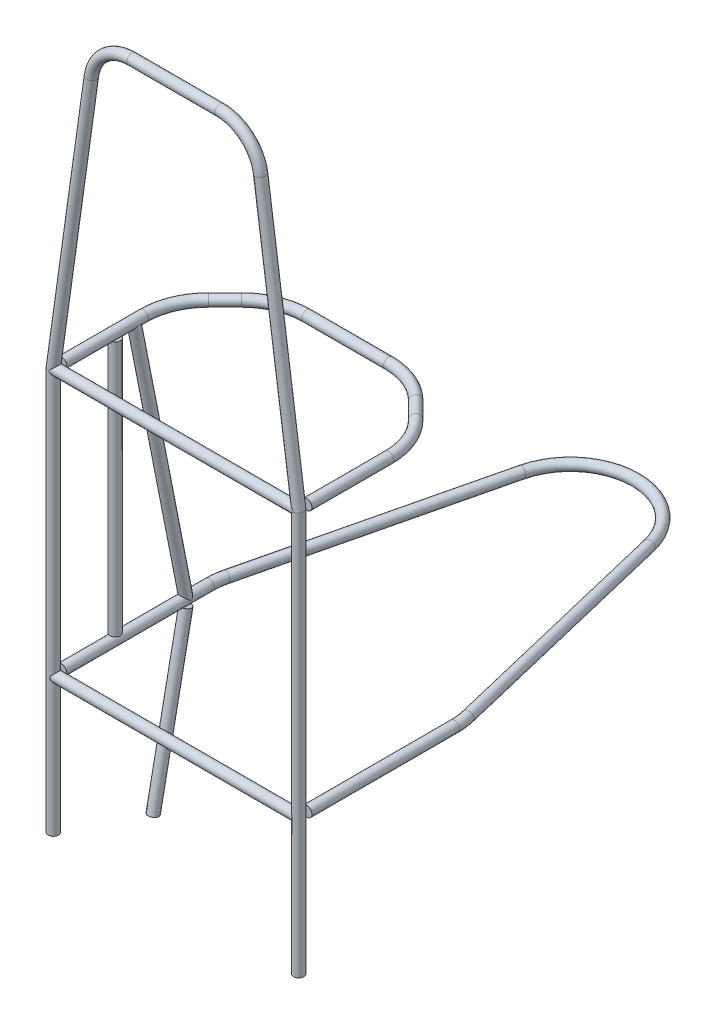
ISO-10303-21;
HEADER;
FILE_DESCRIPTION(('STEP AP214'),'2;1');
FILE_NAME('part.step','',(''),(''),'','','');
FILE_SCHEMA(('AUTOMOTIVE_DESIGN { 1 0 10303 214 1 1 1 1 }'));
ENDSEC;
DATA;
#1=APPLICATION_CONTEXT('core data for automotive mechanical design processes');
#2=APPLICATION_PROTOCOL_DEFINITION('international standard','automotive_design',2000,#1);
#3=PRODUCT_CONTEXT('',#1,'mechanical');
#4=PRODUCT('Part','Part','',(#3));
#5=PRODUCT_RELATED_PRODUCT_CATEGORY('part','',(#4));
#6=PRODUCT_DEFINITION_FORMATION('','',#4);
#7=PRODUCT_DEFINITION_CONTEXT('part definition',#1,'design');
#8=PRODUCT_DEFINITION('design','',#6,#7);
#9=PRODUCT_DEFINITION_SHAPE('','',#8);
#10=(LENGTH_UNIT() NAMED_UNIT(*) SI_UNIT(.MILLI.,.METRE.));
#11=(NAMED_UNIT(*) PLANE_ANGLE_UNIT() SI_UNIT($,.RADIAN.));
#12=(NAMED_UNIT(*) SI_UNIT($,.STERADIAN.) SOLID_ANGLE_UNIT());
#13=UNCERTAINTY_MEASURE_WITH_UNIT(LENGTH_MEASURE(1.E-05),#10,'distance_accuracy_value','');
#14=(GEOMETRIC_REPRESENTATION_CONTEXT(3) GLOBAL_UNCERTAINTY_ASSIGNED_CONTEXT((#13)) GLOBAL_UNIT_ASSIGNED_CONTEXT((#10,
#11,#12)) REPRESENTATION_CONTEXT('',''));
#15=CARTESIAN_POINT('',(0.,0.,0.));
#16=DIRECTION('',(0.,0.,1.));
#17=DIRECTION('',(1.,0.,0.));
#18=AXIS2_PLACEMENT_3D('',#15,#16,#17);
#19=CARTESIAN_POINT('',(-300.,12.5,248.769188656198));
#20=DIRECTION('',(0.,1.,0.));
#21=DIRECTION('',(0.,0.,1.));
#22=AXIS2_PLACEMENT_3D('',#19,#20,#21);
#23=PLANE('',#22);
#24=CARTESIAN_POINT('',(-300.,12.5,248.769188656198));
#25=DIRECTION('',(0.,1.,0.));
#26=DIRECTION('',(0.,0.,1.));
#27=AXIS2_PLACEMENT_3D('',#24,#25,#26);
#28=CIRCLE('',#27,12.5);
#29=CARTESIAN_POINT('',(-300.,12.5,261.269188656198));
#30=VERTEX_POINT('',#29);
#31=EDGE_CURVE('E119',#30,#30,#28,.T.);
#32=ORIENTED_EDGE('',*,*,#31,.F.);
#33=EDGE_LOOP('',(#32));
#34=FACE_BOUND('',#33,.T.);
#35=ADVANCED_FACE('F112',(#34),#23,.F.);
#36=CARTESIAN_POINT('',(-300.,637.5,248.769188656198));
#37=DIRECTION('',(0.,1.,0.));
#38=DIRECTION('',(0.,0.,1.));
#39=AXIS2_PLACEMENT_3D('',#36,#37,#38);
#40=PLANE('',#39);
#41=CARTESIAN_POINT('',(-300.,637.5,248.769188656198));
#42=DIRECTION('',(0.,1.,0.));
#43=DIRECTION('',(0.,0.,1.));
#44=AXIS2_PLACEMENT_3D('',#41,#42,#43);
#45=CIRCLE('',#44,12.5);
#46=CARTESIAN_POINT('',(-300.,637.5,261.269188656198));
#47=VERTEX_POINT('',#46);
#48=EDGE_CURVE('E13',#47,#47,#45,.T.);
#49=ORIENTED_EDGE('',*,*,#48,.T.);
#50=EDGE_LOOP('',(#49));
#51=FACE_BOUND('',#50,.T.);
#52=ADVANCED_FACE('F126',(#51),#40,.T.);
#53=CARTESIAN_POINT('',(-300.,12.5,248.769188656198));
#54=DIRECTION('',(0.,1.,0.));
#55=DIRECTION('',(0.,0.,1.));
#56=AXIS2_PLACEMENT_3D('',#53,#54,#55);
#57=CYLINDRICAL_SURFACE('',#56,12.5);
#58=ORIENTED_EDGE('',*,*,#48,.F.);
#59=EDGE_LOOP('',(#58));
#60=FACE_BOUND('',#59,.T.);
#61=ORIENTED_EDGE('',*,*,#31,.T.);
#62=EDGE_LOOP('',(#61));
#63=FACE_BOUND('',#62,.T.);
#64=ADVANCED_FACE('F128',(#60,#63),#57,.T.);
#65=CLOSED_SHELL('',(#35,#52,#64));
#66=MANIFOLD_SOLID_BREP('B2',#65);
#67=CARTESIAN_POINT('',(-300.,-15.8442127642502,75.8113807876839));
#68=DIRECTION('',(0.,-0.98063301555006,0.195854254008422));
#69=DIRECTION('',(0.,-0.195854254008422,-0.98063301555006));
#70=AXIS2_PLACEMENT_3D('',#67,#68,#69);
#71=PLANE('',#70);
#72=CARTESIAN_POINT('',(-300.,-15.8442127642502,75.8113807876839));
#73=DIRECTION('',(0.,-0.98063301555006,0.195854254008422));
#74=DIRECTION('',(0.,-0.195854254008422,-0.98063301555006));
#75=AXIS2_PLACEMENT_3D('',#72,#73,#74);
#76=CIRCLE('',#75,12.5);
#77=CARTESIAN_POINT('',(-300.,-18.2923909393555,63.5534680933082));
#78=VERTEX_POINT('',#77);
#79=EDGE_CURVE('E172',#78,#78,#76,.T.);
#80=ORIENTED_EDGE('',*,*,#79,.F.);
#81=EDGE_LOOP('',(#80));
#82=FACE_BOUND('',#81,.T.);
#83=ADVANCED_FACE('F165',(#82),#71,.F.);
#84=CARTESIAN_POINT('',(-300.,-417.845852484959,156.100061679687));
#85=DIRECTION('',(0.,-0.98063301555006,0.195854254008422));
#86=DIRECTION('',(0.,-0.195854254008422,-0.98063301555006));
#87=AXIS2_PLACEMENT_3D('',#84,#85,#86);
#88=PLANE('',#87);
#89=CARTESIAN_POINT('',(-300.,-417.845852484959,156.100061679687));
#90=DIRECTION('',(0.,-0.98063301555006,0.195854254008422));
#91=DIRECTION('',(0.,-0.195854254008422,-0.98063301555006));
#92=AXIS2_PLACEMENT_3D('',#89,#90,#91);
#93=CIRCLE('',#92,12.5);
#94=CARTESIAN_POINT('',(-300.,-420.294030660064,143.842148985312));
#95=VERTEX_POINT('',#94);
#96=EDGE_CURVE('E110',#95,#95,#93,.T.);
#97=ORIENTED_EDGE('',*,*,#96,.T.);
#98=EDGE_LOOP('',(#97));
#99=FACE_BOUND('',#98,.T.);
#100=ADVANCED_FACE('F179',(#99),#88,.T.);
#101=CARTESIAN_POINT('',(-300.,-15.8442127642502,75.8113807876839));
#102=DIRECTION('',(0.,-0.98063301555006,0.195854254008422));
#103=DIRECTION('',(0.,-0.195854254008422,-0.98063301555006));
#104=AXIS2_PLACEMENT_3D('',#101,#102,#103);
#105=CYLINDRICAL_SURFACE('',#104,12.5);
#106=ORIENTED_EDGE('',*,*,#96,.F.);
#107=EDGE_LOOP('',(#106));
#108=FACE_BOUND('',#107,.T.);
#109=ORIENTED_EDGE('',*,*,#79,.T.);
#110=EDGE_LOOP('',(#109));
#111=FACE_BOUND('',#110,.T.);
#112=ADVANCED_FACE('F181',(#108,#111),#105,.T.);
#113=CLOSED_SHELL('',(#83,#100,#112));
#114=MANIFOLD_SOLID_BREP('B7',#113);
#115=CARTESIAN_POINT('',(300.,-334.084366164599,400.));
#116=DIRECTION('',(0.,1.,0.));
#117=DIRECTION('',(0.,0.,1.));
#118=AXIS2_PLACEMENT_3D('',#115,#116,#117);
#119=PLANE('',#118);
#120=CARTESIAN_POINT('',(300.,-334.084366164599,400.));
#121=DIRECTION('',(0.,1.,0.));
#122=DIRECTION('',(0.,0.,1.));
#123=AXIS2_PLACEMENT_3D('',#120,#121,#122);
#124=CIRCLE('',#123,12.5);
#125=CARTESIAN_POINT('',(300.,-334.084366164599,412.5));
#126=VERTEX_POINT('',#125);
#127=EDGE_CURVE('E311',#126,#126,#124,.T.);
#128=ORIENTED_EDGE('',*,*,#127,.F.);
#129=EDGE_LOOP('',(#128));
#130=FACE_BOUND('',#129,.T.);
#131=ADVANCED_FACE('F217',(#130),#119,.F.);
#132=CARTESIAN_POINT('',(-300.,-334.084366164599,400.));
#133=DIRECTION('',(0.,-1.,0.));
#134=DIRECTION('',(0.,0.,1.));
#135=AXIS2_PLACEMENT_3D('',#132,#133,#134);
#136=PLANE('',#135);
#137=CARTESIAN_POINT('',(-300.,-334.084366164599,400.));
#138=DIRECTION('',(0.,-1.,0.));
#139=DIRECTION('',(0.,0.,1.));
#140=AXIS2_PLACEMENT_3D('',#137,#138,#139);
#141=CIRCLE('',#140,12.5);
#142=CARTESIAN_POINT('',(-300.,-334.084366164599,412.5));
#143=VERTEX_POINT('',#142);
#144=EDGE_CURVE('E312',#143,#143,#141,.T.);
#145=ORIENTED_EDGE('',*,*,#144,.T.);
#146=EDGE_LOOP('',(#145));
#147=FACE_BOUND('',#146,.T.);
#148=ADVANCED_FACE('F395',(#147),#136,.T.);
#149=CARTESIAN_POINT('',(300.,652.016970416178,400.));
#150=DIRECTION('',(0.,-1.,0.));
#151=DIRECTION('',(0.,0.,-1.));
#152=AXIS2_PLACEMENT_3D('',#149,#150,#151);
#153=CYLINDRICAL_SURFACE('',#152,12.5);
#154=DIRECTION('',(0.,-1.,0.));
#155=VECTOR('',#154,1.);
#156=CARTESIAN_POINT('',(295.579187263628,652.016970416178,411.69215184429));
#157=LINE('',#156,#155);
#158=CARTESIAN_POINT('',(295.579187263628,4.42081273637184,411.69215184429));
#159=VERTEX_POINT('',#158);
#160=CARTESIAN_POINT('',(295.579187263628,-4.42081273637184,411.69215184429));
#161=VERTEX_POINT('',#160);
#162=EDGE_CURVE('E163',#159,#161,#157,.T.);
#163=ORIENTED_EDGE('',*,*,#162,.T.);
#164=CARTESIAN_POINT('',(300.,0.,400.));
#165=DIRECTION('',(0.707106781186547,-0.707106781186547,0.));
#166=DIRECTION('',(-0.707106781186547,-0.707106781186547,0.));
#167=AXIS2_PLACEMENT_3D('',#164,#165,#166);
#168=ELLIPSE('',#167,17.6776695296637,12.5);
#169=CARTESIAN_POINT('',(295.579187263628,-4.42081273637184,388.30784815571));
#170=VERTEX_POINT('',#169);
#171=EDGE_CURVE('E297',#161,#170,#168,.T.);
#172=ORIENTED_EDGE('',*,*,#171,.T.);
#173=DIRECTION('',(0.,-1.,0.));
#174=VECTOR('',#173,1.);
#175=CARTESIAN_POINT('',(295.579187263628,652.016970416178,388.30784815571));
#176=LINE('',#175,#174);
#177=CARTESIAN_POINT('',(295.579187263628,4.42081273637184,388.30784815571));
#178=VERTEX_POINT('',#177);
#179=EDGE_CURVE('E224',#170,#178,#176,.F.);
#180=ORIENTED_EDGE('',*,*,#179,.T.);
#181=CARTESIAN_POINT('',(300.,0.,400.));
#182=DIRECTION('',(-0.707106781186547,-0.707106781186547,0.));
#183=DIRECTION('',(0.707106781186547,-0.707106781186547,0.));
#184=AXIS2_PLACEMENT_3D('',#181,#182,#183);
#185=ELLIPSE('',#184,17.6776695296637,12.5);
#186=EDGE_CURVE('E296',#178,#159,#185,.F.);
#187=ORIENTED_EDGE('',*,*,#186,.T.);
#188=EDGE_LOOP('',(#163,#172,#180,#187));
#189=FACE_BOUND('',#188,.T.);
#190=CARTESIAN_POINT('',(300.,650.,400.));
#191=DIRECTION('',(0.069539267021302,-0.997579215071234,0.));
#192=DIRECTION('',(0.997579215071234,0.069539267021302,0.));
#193=AXIS2_PLACEMENT_3D('',#190,#191,#192);
#194=ELLIPSE('',#193,12.5303332418643,12.5);
#195=CARTESIAN_POINT('',(312.5,650.871350189172,400.));
#196=VERTEX_POINT('',#195);
#197=CARTESIAN_POINT('',(300.,650.,412.5));
#198=VERTEX_POINT('',#197);
#199=EDGE_CURVE('E325',#196,#198,#194,.T.);
#200=ORIENTED_EDGE('',*,*,#199,.T.);
#201=CARTESIAN_POINT('',(300.,650.,400.));
#202=DIRECTION('',(0.707106781186547,-0.707106781186547,0.));
#203=DIRECTION('',(-0.707106781186547,-0.707106781186547,0.));
#204=AXIS2_PLACEMENT_3D('',#201,#202,#203);
#205=ELLIPSE('',#204,17.6776695296637,12.5);
#206=CARTESIAN_POINT('',(300.,650.,387.5));
#207=VERTEX_POINT('',#206);
#208=EDGE_CURVE('E308',#198,#207,#205,.T.);
#209=ORIENTED_EDGE('',*,*,#208,.T.);
#210=EDGE_CURVE('E335',#207,#196,#194,.T.);
#211=ORIENTED_EDGE('',*,*,#210,.T.);
#212=EDGE_LOOP('',(#200,#209,#211));
#213=FACE_BOUND('',#212,.T.);
#214=ORIENTED_EDGE('',*,*,#127,.T.);
#215=EDGE_LOOP('',(#214));
#216=FACE_BOUND('',#215,.T.);
#217=ADVANCED_FACE('F349',(#189,#213,#216),#153,.T.);
#218=CARTESIAN_POINT('',(-300.279838216665,648.002536550464,400.));
#219=DIRECTION('',(0.138741854823479,0.99032858068428,0.));
#220=DIRECTION('',(-0.99032858068428,0.138741854823479,0.));
#221=AXIS2_PLACEMENT_3D('',#218,#219,#220);
#222=CYLINDRICAL_SURFACE('',#221,12.5);
#223=CARTESIAN_POINT('',(-300.,650.,400.));
#224=DIRECTION('',(0.0695392670213019,0.997579215071234,0.));
#225=DIRECTION('',(-0.997579215071234,0.0695392670213019,0.));
#226=AXIS2_PLACEMENT_3D('',#223,#224,#225);
#227=ELLIPSE('',#226,12.5303332418643,12.5);
#228=CARTESIAN_POINT('',(-312.5,650.871350189172,400.));
#229=VERTEX_POINT('',#228);
#230=CARTESIAN_POINT('',(-300.,650.,412.5));
#231=VERTEX_POINT('',#230);
#232=EDGE_CURVE('E317',#229,#231,#227,.T.);
#233=ORIENTED_EDGE('',*,*,#232,.T.);
#234=CARTESIAN_POINT('',(-300.,650.,400.));
#235=DIRECTION('',(-0.656223340478119,0.754566715017128,0.));
#236=DIRECTION('',(0.754566715017128,0.656223340478118,0.));
#237=AXIS2_PLACEMENT_3D('',#234,#235,#236);
#238=ELLIPSE('',#237,19.0483928701662,12.5);
#239=CARTESIAN_POINT('',(-300.,650.,387.5));
#240=VERTEX_POINT('',#239);
#241=EDGE_CURVE('E302',#231,#240,#238,.T.);
#242=ORIENTED_EDGE('',*,*,#241,.T.);
#243=EDGE_CURVE('E315',#240,#229,#227,.T.);
#244=ORIENTED_EDGE('',*,*,#243,.T.);
#245=EDGE_LOOP('',(#233,#242,#244));
#246=FACE_BOUND('',#245,.T.);
#247=CARTESIAN_POINT('',(-206.993357901875,1313.87418548235,400.));
#248=DIRECTION('',(-0.138741854823479,-0.99032858068428,0.));
#249=DIRECTION('',(0.,0.,1.));
#250=AXIS2_PLACEMENT_3D('',#247,#248,#249);
#251=CIRCLE('',#250,12.5);
#252=CARTESIAN_POINT('',(-219.372465160428,1315.60845866764,400.));
#253=VERTEX_POINT('',#252);
#254=EDGE_CURVE('E321',#253,#253,#251,.T.);
#255=ORIENTED_EDGE('',*,*,#254,.T.);
#256=EDGE_LOOP('',(#255));
#257=FACE_BOUND('',#256,.T.);
#258=ADVANCED_FACE('F379',(#246,#257),#222,.T.);
#259=CARTESIAN_POINT('',(-107.960499833447,1300.,400.));
#260=DIRECTION('',(0.,0.,-1.));
#261=DIRECTION('',(-1.,0.,0.));
#262=AXIS2_PLACEMENT_3D('',#259,#260,#261);
#263=TOROIDAL_SURFACE('',#262,100.,12.5);
#264=CARTESIAN_POINT('',(-107.960499833447,1400.,400.));
#265=DIRECTION('',(-1.,0.,0.));
#266=DIRECTION('',(0.,0.,1.));
#267=AXIS2_PLACEMENT_3D('',#264,#265,#266);
#268=CIRCLE('',#267,12.5);
#269=CARTESIAN_POINT('',(-107.960499833447,1412.5,400.));
#270=VERTEX_POINT('',#269);
#271=EDGE_CURVE('E324',#270,#270,#268,.T.);
#272=CARTESIAN_POINT('',(-107.960499833447,1300.,400.));
#273=DIRECTION('',(0.,0.,-1.));
#274=DIRECTION('',(-1.,0.,0.));
#275=AXIS2_PLACEMENT_3D('',#272,#273,#274);
#276=CIRCLE('',#275,112.5);
#277=EDGE_CURVE('',#253,#270,#276,.T.);
#278=ORIENTED_EDGE('',*,*,#254,.F.);
#279=ORIENTED_EDGE('',*,*,#271,.T.);
#280=ORIENTED_EDGE('',*,*,#277,.T.);
#281=ORIENTED_EDGE('',*,*,#277,.F.);
#282=EDGE_LOOP('',(#278,#280,#279,#281));
#283=FACE_BOUND('',#282,.T.);
#284=ADVANCED_FACE('F382',(#283),#263,.T.);
#285=CARTESIAN_POINT('',(-107.960499833447,1400.,400.));
#286=DIRECTION('',(1.,0.,0.));
#287=DIRECTION('',(0.,1.,0.));
#288=AXIS2_PLACEMENT_3D('',#285,#286,#287);
#289=CYLINDRICAL_SURFACE('',#288,12.5);
#290=CARTESIAN_POINT('',(107.960499833447,1400.,400.));
#291=DIRECTION('',(-1.,0.,0.));
#292=DIRECTION('',(0.,0.,1.));
#293=AXIS2_PLACEMENT_3D('',#290,#291,#292);
#294=CIRCLE('',#293,12.5);
#295=CARTESIAN_POINT('',(107.960499833447,1412.5,400.));
#296=VERTEX_POINT('',#295);
#297=EDGE_CURVE('E328',#296,#296,#294,.T.);
#298=ORIENTED_EDGE('',*,*,#297,.T.);
#299=EDGE_LOOP('',(#298));
#300=FACE_BOUND('',#299,.T.);
#301=ORIENTED_EDGE('',*,*,#271,.F.);
#302=EDGE_LOOP('',(#301));
#303=FACE_BOUND('',#302,.T.);
#304=ADVANCED_FACE('F386',(#300,#303),#289,.T.);
#305=CARTESIAN_POINT('',(107.960499833447,1300.,400.));
#306=DIRECTION('',(0.,0.,-1.));
#307=DIRECTION('',(-1.,0.,0.));
#308=AXIS2_PLACEMENT_3D('',#305,#306,#307);
#309=TOROIDAL_SURFACE('',#308,100.,12.5);
#310=CARTESIAN_POINT('',(206.993357901875,1313.87418548235,400.));
#311=DIRECTION('',(-0.138741854823479,0.99032858068428,0.));
#312=DIRECTION('',(0.,0.,1.));
#313=AXIS2_PLACEMENT_3D('',#310,#311,#312);
#314=CIRCLE('',#313,12.5);
#315=CARTESIAN_POINT('',(219.372465160429,1315.60845866764,400.));
#316=VERTEX_POINT('',#315);
#317=EDGE_CURVE('E316',#316,#316,#314,.T.);
#318=CARTESIAN_POINT('',(107.960499833447,1300.,400.));
#319=DIRECTION('',(0.,0.,-1.));
#320=DIRECTION('',(-1.,0.,0.));
#321=AXIS2_PLACEMENT_3D('',#318,#319,#320);
#322=CIRCLE('',#321,112.5);
#323=EDGE_CURVE('',#296,#316,#322,.T.);
#324=ORIENTED_EDGE('',*,*,#297,.F.);
#325=ORIENTED_EDGE('',*,*,#317,.T.);
#326=ORIENTED_EDGE('',*,*,#323,.T.);
#327=ORIENTED_EDGE('',*,*,#323,.F.);
#328=EDGE_LOOP('',(#324,#326,#325,#327));
#329=FACE_BOUND('',#328,.T.);
#330=ADVANCED_FACE('F373',(#329),#309,.T.);
#331=CARTESIAN_POINT('',(206.993357901875,1313.87418548235,400.));
#332=DIRECTION('',(0.138741854823479,-0.99032858068428,0.));
#333=DIRECTION('',(0.99032858068428,0.138741854823479,0.));
#334=AXIS2_PLACEMENT_3D('',#331,#332,#333);
#335=CYLINDRICAL_SURFACE('',#334,12.5);
#336=ORIENTED_EDGE('',*,*,#317,.F.);
#337=EDGE_LOOP('',(#336));
#338=FACE_BOUND('',#337,.T.);
#339=ORIENTED_EDGE('',*,*,#210,.F.);
#340=CARTESIAN_POINT('',(300.,650.,400.));
#341=DIRECTION('',(-0.656223340478118,-0.754566715017128,0.));
#342=DIRECTION('',(0.754566715017128,-0.656223340478119,0.));
#343=AXIS2_PLACEMENT_3D('',#340,#341,#342);
#344=ELLIPSE('',#343,19.0483928701662,12.5);
#345=EDGE_CURVE('E305',#207,#198,#344,.F.);
#346=ORIENTED_EDGE('',*,*,#345,.T.);
#347=ORIENTED_EDGE('',*,*,#199,.F.);
#348=EDGE_LOOP('',(#339,#346,#347));
#349=FACE_BOUND('',#348,.T.);
#350=ADVANCED_FACE('F367',(#338,#349),#335,.T.);
#351=CARTESIAN_POINT('',(-300.,-334.084366164599,400.));
#352=DIRECTION('',(0.,1.,0.));
#353=DIRECTION('',(0.,0.,1.));
#354=AXIS2_PLACEMENT_3D('',#351,#352,#353);
#355=CYLINDRICAL_SURFACE('',#354,12.5);
#356=DIRECTION('',(0.,1.,0.));
#357=VECTOR('',#356,1.);
#358=CARTESIAN_POINT('',(-295.579187263628,-334.084366164599,388.30784815571));
#359=LINE('',#358,#357);
#360=CARTESIAN_POINT('',(-295.579187263628,-4.42081273637156,388.30784815571));
#361=VERTEX_POINT('',#360);
#362=CARTESIAN_POINT('',(-295.579187263628,4.42081273637156,388.30784815571));
#363=VERTEX_POINT('',#362);
#364=EDGE_CURVE('E344',#361,#363,#359,.T.);
#365=ORIENTED_EDGE('',*,*,#364,.F.);
#366=CARTESIAN_POINT('',(-300.,0.,400.));
#367=DIRECTION('',(0.707106781186547,0.707106781186547,0.));
#368=DIRECTION('',(-0.707106781186547,0.707106781186547,0.));
#369=AXIS2_PLACEMENT_3D('',#366,#367,#368);
#370=ELLIPSE('',#369,17.6776695296637,12.5);
#371=CARTESIAN_POINT('',(-295.579187263628,-4.42081273637156,411.69215184429));
#372=VERTEX_POINT('',#371);
#373=EDGE_CURVE('E346',#361,#372,#370,.F.);
#374=ORIENTED_EDGE('',*,*,#373,.T.);
#375=DIRECTION('',(0.,1.,0.));
#376=VECTOR('',#375,1.);
#377=CARTESIAN_POINT('',(-295.579187263628,-334.084366164599,411.69215184429));
#378=LINE('',#377,#376);
#379=CARTESIAN_POINT('',(-295.579187263628,4.42081273637156,411.69215184429));
#380=VERTEX_POINT('',#379);
#381=EDGE_CURVE('E342',#380,#372,#378,.F.);
#382=ORIENTED_EDGE('',*,*,#381,.F.);
#383=CARTESIAN_POINT('',(-300.,0.,400.));
#384=DIRECTION('',(-0.707106781186547,0.707106781186547,0.));
#385=DIRECTION('',(0.707106781186547,0.707106781186547,0.));
#386=AXIS2_PLACEMENT_3D('',#383,#384,#385);
#387=ELLIPSE('',#386,17.6776695296637,12.5);
#388=EDGE_CURVE('E339',#380,#363,#387,.T.);
#389=ORIENTED_EDGE('',*,*,#388,.T.);
#390=EDGE_LOOP('',(#365,#374,#382,#389));
#391=FACE_BOUND('',#390,.T.);
#392=ORIENTED_EDGE('',*,*,#144,.F.);
#393=EDGE_LOOP('',(#392));
#394=FACE_BOUND('',#393,.T.);
#395=ORIENTED_EDGE('',*,*,#243,.F.);
#396=CARTESIAN_POINT('',(-300.,650.,400.));
#397=DIRECTION('',(0.707106781186547,0.707106781186547,0.));
#398=DIRECTION('',(-0.707106781186547,0.707106781186547,0.));
#399=AXIS2_PLACEMENT_3D('',#396,#397,#398);
#400=ELLIPSE('',#399,17.6776695296637,12.5);
#401=EDGE_CURVE('E320',#240,#231,#400,.F.);
#402=ORIENTED_EDGE('',*,*,#401,.T.);
#403=ORIENTED_EDGE('',*,*,#232,.F.);
#404=EDGE_LOOP('',(#395,#402,#403));
#405=FACE_BOUND('',#404,.T.);
#406=ADVANCED_FACE('F361',(#391,#394,#405),#355,.T.);
#407=CARTESIAN_POINT('',(-300.,650.,400.));
#408=DIRECTION('',(1.,0.,0.));
#409=DIRECTION('',(0.,0.,-1.));
#410=AXIS2_PLACEMENT_3D('',#407,#408,#409);
#411=CYLINDRICAL_SURFACE('',#410,12.5);
#412=ORIENTED_EDGE('',*,*,#241,.F.);
#413=ORIENTED_EDGE('',*,*,#401,.F.);
#414=EDGE_LOOP('',(#412,#413));
#415=FACE_BOUND('',#414,.T.);
#416=ORIENTED_EDGE('',*,*,#208,.F.);
#417=ORIENTED_EDGE('',*,*,#345,.F.);
#418=EDGE_LOOP('',(#416,#417));
#419=FACE_BOUND('',#418,.T.);
#420=ADVANCED_FACE('F354',(#415,#419),#411,.T.);
#421=CARTESIAN_POINT('',(295.579187263628,0.,400.));
#422=DIRECTION('',(1.,0.,0.));
#423=DIRECTION('',(0.,0.,-1.));
#424=AXIS2_PLACEMENT_3D('',#421,#422,#423);
#425=PLANE('',#424);
#426=ORIENTED_EDGE('',*,*,#162,.F.);
#427=CARTESIAN_POINT('',(295.579187263628,0.,400.));
#428=DIRECTION('',(1.,0.,0.));
#429=DIRECTION('',(0.,0.,-1.));
#430=AXIS2_PLACEMENT_3D('',#427,#428,#429);
#431=CIRCLE('',#430,12.5);
#432=EDGE_CURVE('E231',#159,#161,#431,.T.);
#433=ORIENTED_EDGE('',*,*,#432,.T.);
#434=EDGE_LOOP('',(#426,#433));
#435=FACE_BOUND('',#434,.T.);
#436=ADVANCED_FACE('F352',(#435),#425,.T.);
#437=ORIENTED_EDGE('',*,*,#179,.F.);
#438=CARTESIAN_POINT('',(295.579187263628,0.,387.5));
#439=VERTEX_POINT('',#438);
#440=EDGE_CURVE('E287',#170,#439,#431,.T.);
#441=ORIENTED_EDGE('',*,*,#440,.T.);
#442=EDGE_CURVE('E290',#439,#178,#431,.T.);
#443=ORIENTED_EDGE('',*,*,#442,.T.);
#444=EDGE_LOOP('',(#437,#441,#443));
#445=FACE_BOUND('',#444,.T.);
#446=ADVANCED_FACE('F289',(#445),#425,.T.);
#447=CARTESIAN_POINT('',(-295.579187263628,0.,400.));
#448=DIRECTION('',(1.,0.,0.));
#449=DIRECTION('',(0.,0.,-1.));
#450=AXIS2_PLACEMENT_3D('',#447,#448,#449);
#451=PLANE('',#450);
#452=CARTESIAN_POINT('',(-295.579187263628,0.,400.));
#453=DIRECTION('',(1.,0.,0.));
#454=DIRECTION('',(0.,0.,-1.));
#455=AXIS2_PLACEMENT_3D('',#452,#453,#454);
#456=CIRCLE('',#455,12.5);
#457=CARTESIAN_POINT('',(-295.579187263628,0.,387.5));
#458=VERTEX_POINT('',#457);
#459=EDGE_CURVE('E506',#361,#458,#456,.T.);
#460=ORIENTED_EDGE('',*,*,#459,.F.);
#461=ORIENTED_EDGE('',*,*,#364,.T.);
#462=EDGE_CURVE('E239',#458,#363,#456,.T.);
#463=ORIENTED_EDGE('',*,*,#462,.F.);
#464=EDGE_LOOP('',(#460,#461,#463));
#465=FACE_BOUND('',#464,.T.);
#466=ADVANCED_FACE('F360',(#465),#451,.F.);
#467=EDGE_CURVE('E508',#380,#372,#456,.T.);
#468=ORIENTED_EDGE('',*,*,#467,.F.);
#469=ORIENTED_EDGE('',*,*,#381,.T.);
#470=EDGE_LOOP('',(#468,#469));
#471=FACE_BOUND('',#470,.T.);
#472=ADVANCED_FACE('F485',(#471),#451,.F.);
#473=CARTESIAN_POINT('',(-295.579187263628,0.,400.));
#474=DIRECTION('',(1.,0.,0.));
#475=DIRECTION('',(0.,0.,-1.));
#476=AXIS2_PLACEMENT_3D('',#473,#474,#475);
#477=CYLINDRICAL_SURFACE('',#476,12.5);
#478=ORIENTED_EDGE('',*,*,#373,.F.);
#479=ORIENTED_EDGE('',*,*,#459,.T.);
#480=ORIENTED_EDGE('',*,*,#462,.T.);
#481=ORIENTED_EDGE('',*,*,#388,.F.);
#482=ORIENTED_EDGE('',*,*,#467,.T.);
#483=EDGE_LOOP('',(#478,#479,#480,#481,#482));
#484=FACE_BOUND('',#483,.T.);
#485=ORIENTED_EDGE('',*,*,#171,.F.);
#486=ORIENTED_EDGE('',*,*,#432,.F.);
#487=ORIENTED_EDGE('',*,*,#186,.F.);
#488=ORIENTED_EDGE('',*,*,#442,.F.);
#489=ORIENTED_EDGE('',*,*,#440,.F.);
#490=EDGE_LOOP('',(#485,#486,#487,#488,#489));
#491=FACE_BOUND('',#490,.T.);
#492=ADVANCED_FACE('F294',(#484,#491),#477,.T.);
#493=CLOSED_SHELL('',(#131,#148,#217,#258,#284,#304,#330,#350,#406,#420,#436,#446,#466,#472,#492));
#494=MANIFOLD_SOLID_BREP('B104',#493);
#495=CARTESIAN_POINT('',(-300.,648.324159637843,203.112947280133));
#496=DIRECTION('',(0.,-0.981177641249325,-0.19310731812236));
#497=DIRECTION('',(0.,0.19310731812236,-0.981177641249325));
#498=AXIS2_PLACEMENT_3D('',#495,#496,#497);
#499=CYLINDRICAL_SURFACE('',#498,12.5);
#500=CARTESIAN_POINT('',(-300.,0.,75.5151153705249));
#501=DIRECTION('',(0.,-0.772368862047908,0.635174260293047));
#502=DIRECTION('',(0.,0.635174260293047,0.772368862047908));
#503=AXIS2_PLACEMENT_3D('',#500,#501,#502);
#504=ELLIPSE('',#503,19.6796387722527,12.5);
#505=CARTESIAN_POINT('',(-287.5,0.,75.5151153705249));
#506=VERTEX_POINT('',#505);
#507=CARTESIAN_POINT('',(-312.5,1.35291613369145E-13,75.5151153705248));
#508=VERTEX_POINT('',#507);
#509=EDGE_CURVE('E606',#506,#508,#504,.T.);
#510=ORIENTED_EDGE('',*,*,#509,.F.);
#511=CARTESIAN_POINT('',(-300.,0.,75.5151153705249));
#512=DIRECTION('',(0.,0.635174260293047,0.772368862047908));
#513=DIRECTION('',(0.,-0.772368862047908,0.635174260293047));
#514=AXIS2_PLACEMENT_3D('',#511,#512,#513);
#515=ELLIPSE('',#514,16.1839771308967,12.5);
#516=EDGE_CURVE('E604',#508,#506,#515,.F.);
#517=ORIENTED_EDGE('',*,*,#516,.F.);
#518=EDGE_LOOP('',(#510,#517));
#519=FACE_BOUND('',#518,.T.);
#520=CARTESIAN_POINT('',(-300.,648.324159637843,203.112947280133));
#521=DIRECTION('',(0.,-0.981177641249325,-0.19310731812236));
#522=DIRECTION('',(0.,0.19310731812236,-0.981177641249325));
#523=AXIS2_PLACEMENT_3D('',#520,#521,#522);
#524=CIRCLE('',#523,12.5);
#525=CARTESIAN_POINT('',(-287.579166914115,648.595398471955,201.734783665945));
#526=VERTEX_POINT('',#525);
#527=CARTESIAN_POINT('',(-287.673749114111,647.92309386391,205.150761143841));
#528=VERTEX_POINT('',#527);
#529=EDGE_CURVE('E580',#526,#528,#524,.T.);
#530=ORIENTED_EDGE('',*,*,#529,.T.);
#531=CARTESIAN_POINT('',(-300.,650.,203.442772404893));
#532=DIRECTION('',(0.,-0.635174260293047,-0.772368862047908));
#533=DIRECTION('',(0.,-0.772368862047908,0.635174260293047));
#534=AXIS2_PLACEMENT_3D('',#531,#532,#533);
#535=ELLIPSE('',#534,16.1839771308967,12.5);
#536=CARTESIAN_POINT('',(-312.326250885889,647.92309386391,205.150761143841));
#537=VERTEX_POINT('',#536);
#538=EDGE_CURVE('E537',#528,#537,#535,.T.);
#539=ORIENTED_EDGE('',*,*,#538,.T.);
#540=CARTESIAN_POINT('',(-312.420833085885,648.595398471955,201.734783665945));
#541=VERTEX_POINT('',#540);
#542=EDGE_CURVE('E578',#537,#541,#524,.T.);
#543=ORIENTED_EDGE('',*,*,#542,.T.);
#544=CARTESIAN_POINT('',(-300.,650.,203.442772404893));
#545=DIRECTION('',(0.,-0.772368862047908,0.635174260293047));
#546=DIRECTION('',(0.,-0.635174260293047,-0.772368862047908));
#547=AXIS2_PLACEMENT_3D('',#544,#545,#546);
#548=ELLIPSE('',#547,19.6796387722527,12.5);
#549=EDGE_CURVE('E567',#541,#526,#548,.T.);
#550=ORIENTED_EDGE('',*,*,#549,.T.);
#551=EDGE_LOOP('',(#530,#539,#543,#550));
#552=FACE_BOUND('',#551,.T.);
#553=ADVANCED_FACE('F518',(#519,#552),#499,.T.);
#554=CARTESIAN_POINT('',(-300.,648.324159637843,203.112947280133));
#555=DIRECTION('',(0.,-0.981177641249325,-0.19310731812236));
#556=DIRECTION('',(0.,0.19310731812236,-0.981177641249325));
#557=AXIS2_PLACEMENT_3D('',#554,#555,#556);
#558=PLANE('',#557);
#559=CARTESIAN_POINT('',(-300.,650.,194.598007972604));
#560=DIRECTION('',(0.,-0.981177641249325,-0.19310731812236));
#561=DIRECTION('',(0.,0.19310731812236,-0.981177641249325));
#562=AXIS2_PLACEMENT_3D('',#559,#560,#561);
#563=ELLIPSE('',#562,64.7308456330979,12.5);
#564=EDGE_CURVE('E215',#541,#537,#563,.F.);
#565=ORIENTED_EDGE('',*,*,#564,.F.);
#566=ORIENTED_EDGE('',*,*,#542,.F.);
#567=EDGE_LOOP('',(#565,#566));
#568=FACE_BOUND('',#567,.T.);
#569=ADVANCED_FACE('F615',(#568),#558,.F.);
#570=CARTESIAN_POINT('',(300.,0.,380.));
#571=DIRECTION('',(0.,0.,1.));
#572=DIRECTION('',(1.,0.,0.));
#573=AXIS2_PLACEMENT_3D('',#570,#571,#572);
#574=PLANE('',#573);
#575=CARTESIAN_POINT('',(300.,0.,380.));
#576=DIRECTION('',(0.,0.,1.));
#577=DIRECTION('',(1.,0.,0.));
#578=AXIS2_PLACEMENT_3D('',#575,#576,#577);
#579=CIRCLE('',#578,12.5);
#580=CARTESIAN_POINT('',(312.5,0.,380.));
#581=VERTEX_POINT('',#580);
#582=EDGE_CURVE('E581',#581,#581,#579,.T.);
#583=ORIENTED_EDGE('',*,*,#582,.T.);
#584=EDGE_LOOP('',(#583));
#585=FACE_BOUND('',#584,.T.);
#586=ADVANCED_FACE('F520',(#585),#574,.T.);
#587=CARTESIAN_POINT('',(-300.,0.,380.));
#588=DIRECTION('',(0.,0.,-1.));
#589=DIRECTION('',(-1.,0.,0.));
#590=AXIS2_PLACEMENT_3D('',#587,#588,#589);
#591=PLANE('',#590);
#592=CARTESIAN_POINT('',(-300.,0.,380.));
#593=DIRECTION('',(0.,0.,-1.));
#594=DIRECTION('',(-1.,0.,0.));
#595=AXIS2_PLACEMENT_3D('',#592,#593,#594);
#596=CIRCLE('',#595,12.5);
#597=CARTESIAN_POINT('',(-312.5,0.,380.));
#598=VERTEX_POINT('',#597);
#599=EDGE_CURVE('E602',#598,#598,#596,.T.);
#600=ORIENTED_EDGE('',*,*,#599,.F.);
#601=EDGE_LOOP('',(#600));
#602=FACE_BOUND('',#601,.T.);
#603=ADVANCED_FACE('F623',(#602),#591,.F.);
#604=CARTESIAN_POINT('',(300.,0.,380.));
#605=DIRECTION('',(0.,0.,-1.));
#606=DIRECTION('',(-1.,0.,0.));
#607=AXIS2_PLACEMENT_3D('',#604,#605,#606);
#608=CYLINDRICAL_SURFACE('',#607,12.5);
#609=CARTESIAN_POINT('',(300.,0.,18.9372479425227));
#610=DIRECTION('',(0.,0.,1.));
#611=DIRECTION('',(1.,0.,0.));
#612=AXIS2_PLACEMENT_3D('',#609,#610,#611);
#613=CIRCLE('',#612,12.5);
#614=CARTESIAN_POINT('',(312.5,0.,18.9372479425227));
#615=VERTEX_POINT('',#614);
#616=EDGE_CURVE('E584',#615,#615,#613,.T.);
#617=ORIENTED_EDGE('',*,*,#616,.T.);
#618=EDGE_LOOP('',(#617));
#619=FACE_BOUND('',#618,.T.);
#620=ORIENTED_EDGE('',*,*,#582,.F.);
#621=EDGE_LOOP('',(#620));
#622=FACE_BOUND('',#621,.T.);
#623=ADVANCED_FACE('F641',(#619,#622),#608,.T.);
#624=CARTESIAN_POINT('',(140.,0.,18.9372479425227));
#625=DIRECTION('',(0.,1.,0.));
#626=DIRECTION('',(0.,0.,1.));
#627=AXIS2_PLACEMENT_3D('',#624,#625,#626);
#628=TOROIDAL_SURFACE('',#627,160.,12.5);
#629=CARTESIAN_POINT('',(295.579187263628,0.,-18.4140102744222));
#630=DIRECTION('',(0.233445363855906,0.,0.972369920397677));
#631=DIRECTION('',(0.972369920397676,0.,-0.233445363855906));
#632=AXIS2_PLACEMENT_3D('',#629,#630,#631);
#633=CIRCLE('',#632,12.5);
#634=CARTESIAN_POINT('',(307.733811268599,0.,-21.332077322621));
#635=VERTEX_POINT('',#634);
#636=EDGE_CURVE('E587',#635,#635,#633,.T.);
#637=CARTESIAN_POINT('',(140.,0.,18.9372479425227));
#638=DIRECTION('',(0.,1.,0.));
#639=DIRECTION('',(0.,0.,1.));
#640=AXIS2_PLACEMENT_3D('',#637,#638,#639);
#641=CIRCLE('',#640,172.5);
#642=EDGE_CURVE('',#615,#635,#641,.T.);
#643=ORIENTED_EDGE('',*,*,#616,.F.);
#644=ORIENTED_EDGE('',*,*,#636,.T.);
#645=ORIENTED_EDGE('',*,*,#642,.T.);
#646=ORIENTED_EDGE('',*,*,#642,.F.);
#647=EDGE_LOOP('',(#643,#645,#644,#646));
#648=FACE_BOUND('',#647,.T.);
#649=ADVANCED_FACE('F646',(#648),#628,.T.);
#650=CARTESIAN_POINT('',(295.579187263628,0.,-18.4140102744222));
#651=DIRECTION('',(-0.233445363855906,0.,-0.972369920397677));
#652=DIRECTION('',(-0.972369920397677,0.,0.233445363855906));
#653=AXIS2_PLACEMENT_3D('',#650,#651,#652);
#654=CYLINDRICAL_SURFACE('',#653,12.5);
#655=CARTESIAN_POINT('',(155.579187263628,0.,-601.555978087079));
#656=DIRECTION('',(0.233445363855906,0.,0.972369920397676));
#657=DIRECTION('',(0.972369920397676,0.,-0.233445363855906));
#658=AXIS2_PLACEMENT_3D('',#655,#656,#657);
#659=CIRCLE('',#658,12.5);
#660=CARTESIAN_POINT('',(167.733811268599,0.,-604.474045135278));
#661=VERTEX_POINT('',#660);
#662=EDGE_CURVE('E590',#661,#661,#659,.T.);
#663=ORIENTED_EDGE('',*,*,#662,.T.);
#664=EDGE_LOOP('',(#663));
#665=FACE_BOUND('',#664,.T.);
#666=ORIENTED_EDGE('',*,*,#636,.F.);
#667=EDGE_LOOP('',(#666));
#668=FACE_BOUND('',#667,.T.);
#669=ADVANCED_FACE('F661',(#665,#668),#654,.T.);
#670=CARTESIAN_POINT('',(0.,0.,-564.204719870134));
#671=DIRECTION('',(0.,1.,0.));
#672=DIRECTION('',(0.,0.,1.));
#673=AXIS2_PLACEMENT_3D('',#670,#671,#672);
#674=TOROIDAL_SURFACE('',#673,160.,12.5);
#675=CARTESIAN_POINT('',(-155.579187263628,0.,-601.555978087079));
#676=DIRECTION('',(0.233445363855906,0.,-0.972369920397677));
#677=DIRECTION('',(-0.972369920397677,0.,-0.233445363855906));
#678=AXIS2_PLACEMENT_3D('',#675,#676,#677);
#679=CIRCLE('',#678,12.5);
#680=CARTESIAN_POINT('',(-167.733811268599,0.,-604.474045135278));
#681=VERTEX_POINT('',#680);
#682=EDGE_CURVE('E593',#681,#681,#679,.T.);
#683=CARTESIAN_POINT('',(0.,0.,-564.204719870134));
#684=DIRECTION('',(0.,1.,0.));
#685=DIRECTION('',(0.,0.,1.));
#686=AXIS2_PLACEMENT_3D('',#683,#684,#685);
#687=CIRCLE('',#686,172.5);
#688=EDGE_CURVE('',#661,#681,#687,.T.);
#689=ORIENTED_EDGE('',*,*,#662,.F.);
#690=ORIENTED_EDGE('',*,*,#682,.T.);
#691=ORIENTED_EDGE('',*,*,#688,.T.);
#692=ORIENTED_EDGE('',*,*,#688,.F.);
#693=EDGE_LOOP('',(#689,#691,#690,#692));
#694=FACE_BOUND('',#693,.T.);
#695=ADVANCED_FACE('F656',(#694),#674,.T.);
#696=CARTESIAN_POINT('',(-155.579187263628,0.,-601.555978087079));
#697=DIRECTION('',(-0.233445363855906,0.,0.972369920397676));
#698=DIRECTION('',(0.972369920397677,0.,0.233445363855906));
#699=AXIS2_PLACEMENT_3D('',#696,#697,#698);
#700=CYLINDRICAL_SURFACE('',#699,12.5);
#701=CARTESIAN_POINT('',(-295.579187263628,0.,-18.4140102744221));
#702=DIRECTION('',(0.233445363855906,0.,-0.972369920397676));
#703=DIRECTION('',(-0.972369920397676,0.,-0.233445363855906));
#704=AXIS2_PLACEMENT_3D('',#701,#702,#703);
#705=CIRCLE('',#704,12.5);
#706=CARTESIAN_POINT('',(-307.733811268599,0.,-21.332077322621));
#707=VERTEX_POINT('',#706);
#708=EDGE_CURVE('E596',#707,#707,#705,.T.);
#709=ORIENTED_EDGE('',*,*,#708,.T.);
#710=EDGE_LOOP('',(#709));
#711=FACE_BOUND('',#710,.T.);
#712=ORIENTED_EDGE('',*,*,#682,.F.);
#713=EDGE_LOOP('',(#712));
#714=FACE_BOUND('',#713,.T.);
#715=ADVANCED_FACE('F635',(#711,#714),#700,.T.);
#716=CARTESIAN_POINT('',(-140.,0.,18.9372479425228));
#717=DIRECTION('',(0.,1.,0.));
#718=DIRECTION('',(0.,0.,1.));
#719=AXIS2_PLACEMENT_3D('',#716,#717,#718);
#720=TOROIDAL_SURFACE('',#719,160.,12.5);
#721=CARTESIAN_POINT('',(-300.,0.,18.9372479425229));
#722=DIRECTION('',(0.,0.,-1.));
#723=DIRECTION('',(-1.,0.,0.));
#724=AXIS2_PLACEMENT_3D('',#721,#722,#723);
#725=CIRCLE('',#724,12.5);
#726=CARTESIAN_POINT('',(-312.5,0.,18.9372479425229));
#727=VERTEX_POINT('',#726);
#728=EDGE_CURVE('E599',#727,#727,#725,.T.);
#729=CARTESIAN_POINT('',(-140.,0.,18.9372479425228));
#730=DIRECTION('',(0.,1.,0.));
#731=DIRECTION('',(0.,0.,1.));
#732=AXIS2_PLACEMENT_3D('',#729,#730,#731);
#733=CIRCLE('',#732,172.5);
#734=EDGE_CURVE('',#707,#727,#733,.T.);
#735=ORIENTED_EDGE('',*,*,#708,.F.);
#736=ORIENTED_EDGE('',*,*,#728,.T.);
#737=ORIENTED_EDGE('',*,*,#734,.T.);
#738=ORIENTED_EDGE('',*,*,#734,.F.);
#739=EDGE_LOOP('',(#735,#737,#736,#738));
#740=FACE_BOUND('',#739,.T.);
#741=ADVANCED_FACE('F630',(#740),#720,.T.);
#742=CARTESIAN_POINT('',(-300.,0.,18.9372479425228));
#743=DIRECTION('',(0.,0.,1.));
#744=DIRECTION('',(1.,0.,0.));
#745=AXIS2_PLACEMENT_3D('',#742,#743,#744);
#746=CYLINDRICAL_SURFACE('',#745,12.5);
#747=ORIENTED_EDGE('',*,*,#516,.T.);
#748=ORIENTED_EDGE('',*,*,#509,.T.);
#749=EDGE_LOOP('',(#747,#748));
#750=FACE_BOUND('',#749,.T.);
#751=ORIENTED_EDGE('',*,*,#599,.T.);
#752=EDGE_LOOP('',(#751));
#753=FACE_BOUND('',#752,.T.);
#754=ORIENTED_EDGE('',*,*,#728,.F.);
#755=EDGE_LOOP('',(#754));
#756=FACE_BOUND('',#755,.T.);
#757=ADVANCED_FACE('F618',(#750,#753,#756),#746,.T.);
#758=EDGE_CURVE('E522',#528,#526,#563,.F.);
#759=ORIENTED_EDGE('',*,*,#758,.F.);
#760=ORIENTED_EDGE('',*,*,#529,.F.);
#761=EDGE_LOOP('',(#759,#760));
#762=FACE_BOUND('',#761,.T.);
#763=ADVANCED_FACE('F614',(#762),#558,.F.);
#764=CARTESIAN_POINT('',(-300.,650.,380.));
#765=DIRECTION('',(0.,0.,-1.));
#766=DIRECTION('',(-1.,0.,0.));
#767=AXIS2_PLACEMENT_3D('',#764,#765,#766);
#768=CYLINDRICAL_SURFACE('',#767,12.5);
#769=CARTESIAN_POINT('',(-300.,650.,180.));
#770=DIRECTION('',(0.,0.,1.));
#771=DIRECTION('',(1.,0.,0.));
#772=AXIS2_PLACEMENT_3D('',#769,#770,#771);
#773=CIRCLE('',#772,12.5);
#774=CARTESIAN_POINT('',(-312.5,650.,180.));
#775=VERTEX_POINT('',#774);
#776=EDGE_CURVE('E820',#775,#775,#773,.T.);
#777=ORIENTED_EDGE('',*,*,#776,.T.);
#778=EDGE_LOOP('',(#777));
#779=FACE_BOUND('',#778,.T.);
#780=CARTESIAN_POINT('',(-300.,650.,380.));
#781=DIRECTION('',(0.,0.,1.));
#782=DIRECTION('',(1.,0.,0.));
#783=AXIS2_PLACEMENT_3D('',#780,#781,#782);
#784=CIRCLE('',#783,12.5);
#785=CARTESIAN_POINT('',(-287.5,650.,380.));
#786=VERTEX_POINT('',#785);
#787=EDGE_CURVE('E822',#786,#786,#784,.T.);
#788=ORIENTED_EDGE('',*,*,#787,.F.);
#789=EDGE_LOOP('',(#788));
#790=FACE_BOUND('',#789,.T.);
#791=ORIENTED_EDGE('',*,*,#549,.F.);
#792=ORIENTED_EDGE('',*,*,#564,.T.);
#793=ORIENTED_EDGE('',*,*,#538,.F.);
#794=ORIENTED_EDGE('',*,*,#758,.T.);
#795=EDGE_LOOP('',(#791,#792,#793,#794));
#796=FACE_BOUND('',#795,.T.);
#797=ADVANCED_FACE('F612',(#779,#790,#796),#768,.T.);
#798=CARTESIAN_POINT('',(-300.,650.,380.));
#799=DIRECTION('',(0.,0.,1.));
#800=DIRECTION('',(1.,0.,0.));
#801=AXIS2_PLACEMENT_3D('',#798,#799,#800);
#802=PLANE('',#801);
#803=ORIENTED_EDGE('',*,*,#787,.T.);
#804=EDGE_LOOP('',(#803));
#805=FACE_BOUND('',#804,.T.);
#806=ADVANCED_FACE('F718',(#805),#802,.T.);
#807=CARTESIAN_POINT('',(300.,650.,380.));
#808=DIRECTION('',(0.,0.,-1.));
#809=DIRECTION('',(-1.,0.,0.));
#810=AXIS2_PLACEMENT_3D('',#807,#808,#809);
#811=PLANE('',#810);
#812=CARTESIAN_POINT('',(300.,650.,380.));
#813=DIRECTION('',(0.,0.,-1.));
#814=DIRECTION('',(-1.,0.,0.));
#815=AXIS2_PLACEMENT_3D('',#812,#813,#814);
#816=CIRCLE('',#815,12.5);
#817=CARTESIAN_POINT('',(287.5,650.,380.));
#818=VERTEX_POINT('',#817);
#819=EDGE_CURVE('E563',#818,#818,#816,.T.);
#820=ORIENTED_EDGE('',*,*,#819,.F.);
#821=EDGE_LOOP('',(#820));
#822=FACE_BOUND('',#821,.T.);
#823=ADVANCED_FACE('F723',(#822),#811,.F.);
#824=CARTESIAN_POINT('',(-140.,650.,180.));
#825=DIRECTION('',(0.,-1.,0.));
#826=DIRECTION('',(0.,0.,-1.));
#827=AXIS2_PLACEMENT_3D('',#824,#825,#826);
#828=TOROIDAL_SURFACE('',#827,160.,12.5);
#829=CARTESIAN_POINT('',(-253.137084989848,650.,66.8629150101523));
#830=DIRECTION('',(-0.707106781186547,0.,0.707106781186548));
#831=DIRECTION('',(0.707106781186548,0.,0.707106781186547));
#832=AXIS2_PLACEMENT_3D('',#829,#830,#831);
#833=CIRCLE('',#832,12.5);
#834=CARTESIAN_POINT('',(-261.975919754679,650.,58.0240802453204));
#835=VERTEX_POINT('',#834);
#836=EDGE_CURVE('E824',#835,#835,#833,.T.);
#837=CARTESIAN_POINT('',(-140.,650.,180.));
#838=DIRECTION('',(0.,-1.,0.));
#839=DIRECTION('',(0.,0.,-1.));
#840=AXIS2_PLACEMENT_3D('',#837,#838,#839);
#841=CIRCLE('',#840,172.5);
#842=EDGE_CURVE('',#775,#835,#841,.T.);
#843=ORIENTED_EDGE('',*,*,#776,.F.);
#844=ORIENTED_EDGE('',*,*,#836,.T.);
#845=ORIENTED_EDGE('',*,*,#842,.T.);
#846=ORIENTED_EDGE('',*,*,#842,.F.);
#847=EDGE_LOOP('',(#843,#845,#844,#846));
#848=FACE_BOUND('',#847,.T.);
#849=ADVANCED_FACE('F734',(#848),#828,.T.);
#850=CARTESIAN_POINT('',(-253.137084989848,650.,66.8629150101523));
#851=DIRECTION('',(0.707106781186547,0.,-0.707106781186548));
#852=DIRECTION('',(-0.707106781186548,0.,-0.707106781186547));
#853=AXIS2_PLACEMENT_3D('',#850,#851,#852);
#854=CYLINDRICAL_SURFACE('',#853,12.5);
#855=CARTESIAN_POINT('',(-213.137084989848,650.,26.8629150101523));
#856=DIRECTION('',(-0.707106781186547,0.,0.707106781186548));
#857=DIRECTION('',(0.707106781186548,0.,0.707106781186547));
#858=AXIS2_PLACEMENT_3D('',#855,#856,#857);
#859=CIRCLE('',#858,12.5);
#860=CARTESIAN_POINT('',(-221.975919754679,650.,18.0240802453205));
#861=VERTEX_POINT('',#860);
#862=EDGE_CURVE('E829',#861,#861,#859,.T.);
#863=ORIENTED_EDGE('',*,*,#862,.T.);
#864=EDGE_LOOP('',(#863));
#865=FACE_BOUND('',#864,.T.);
#866=ORIENTED_EDGE('',*,*,#836,.F.);
#867=EDGE_LOOP('',(#866));
#868=FACE_BOUND('',#867,.T.);
#869=ADVANCED_FACE('F743',(#865,#868),#854,.T.);
#870=CARTESIAN_POINT('',(-100.,650.,140.));
#871=DIRECTION('',(0.,-1.,0.));
#872=DIRECTION('',(0.,0.,-1.));
#873=AXIS2_PLACEMENT_3D('',#870,#871,#872);
#874=TOROIDAL_SURFACE('',#873,160.,12.5);
#875=CARTESIAN_POINT('',(-100.,650.,-20.0000000000001));
#876=DIRECTION('',(-1.,0.,0.));
#877=DIRECTION('',(0.,0.,1.));
#878=AXIS2_PLACEMENT_3D('',#875,#876,#877);
#879=CIRCLE('',#878,12.5);
#880=CARTESIAN_POINT('',(-100.,650.,-32.5000000000001));
#881=VERTEX_POINT('',#880);
#882=EDGE_CURVE('E832',#881,#881,#879,.T.);
#883=CARTESIAN_POINT('',(-100.,650.,140.));
#884=DIRECTION('',(0.,-1.,0.));
#885=DIRECTION('',(0.,0.,-1.));
#886=AXIS2_PLACEMENT_3D('',#883,#884,#885);
#887=CIRCLE('',#886,172.5);
#888=EDGE_CURVE('',#861,#881,#887,.T.);
#889=ORIENTED_EDGE('',*,*,#862,.F.);
#890=ORIENTED_EDGE('',*,*,#882,.T.);
#891=ORIENTED_EDGE('',*,*,#888,.T.);
#892=ORIENTED_EDGE('',*,*,#888,.F.);
#893=EDGE_LOOP('',(#889,#891,#890,#892));
#894=FACE_BOUND('',#893,.T.);
#895=ADVANCED_FACE('F753',(#894),#874,.T.);
#896=CARTESIAN_POINT('',(-100.,650.,-20.));
#897=DIRECTION('',(1.,0.,0.));
#898=DIRECTION('',(0.,0.,-1.));
#899=AXIS2_PLACEMENT_3D('',#896,#897,#898);
#900=CYLINDRICAL_SURFACE('',#899,12.5);
#901=CARTESIAN_POINT('',(100.,650.,-20.));
#902=DIRECTION('',(-1.,0.,0.));
#903=DIRECTION('',(0.,0.,1.));
#904=AXIS2_PLACEMENT_3D('',#901,#902,#903);
#905=CIRCLE('',#904,12.5);
#906=CARTESIAN_POINT('',(100.,650.,-32.5000000000001));
#907=VERTEX_POINT('',#906);
#908=EDGE_CURVE('E835',#907,#907,#905,.T.);
#909=ORIENTED_EDGE('',*,*,#908,.T.);
#910=EDGE_LOOP('',(#909));
#911=FACE_BOUND('',#910,.T.);
#912=ORIENTED_EDGE('',*,*,#882,.F.);
#913=EDGE_LOOP('',(#912));
#914=FACE_BOUND('',#913,.T.);
#915=ADVANCED_FACE('F763',(#911,#914),#900,.T.);
#916=CARTESIAN_POINT('',(100.,650.,140.));
#917=DIRECTION('',(0.,-1.,0.));
#918=DIRECTION('',(0.,0.,-1.));
#919=AXIS2_PLACEMENT_3D('',#916,#917,#918);
#920=TOROIDAL_SURFACE('',#919,160.,12.5);
#921=CARTESIAN_POINT('',(213.137084989848,650.,26.8629150101523));
#922=DIRECTION('',(-0.707106781186548,0.,-0.707106781186547));
#923=DIRECTION('',(-0.707106781186547,0.,0.707106781186548));
#924=AXIS2_PLACEMENT_3D('',#921,#922,#923);
#925=CIRCLE('',#924,12.5);
#926=CARTESIAN_POINT('',(221.975919754679,650.,18.0240802453204));
#927=VERTEX_POINT('',#926);
#928=EDGE_CURVE('E838',#927,#927,#925,.T.);
#929=CARTESIAN_POINT('',(100.,650.,140.));
#930=DIRECTION('',(0.,-1.,0.));
#931=DIRECTION('',(0.,0.,-1.));
#932=AXIS2_PLACEMENT_3D('',#929,#930,#931);
#933=CIRCLE('',#932,172.5);
#934=EDGE_CURVE('',#907,#927,#933,.T.);
#935=ORIENTED_EDGE('',*,*,#908,.F.);
#936=ORIENTED_EDGE('',*,*,#928,.T.);
#937=ORIENTED_EDGE('',*,*,#934,.T.);
#938=ORIENTED_EDGE('',*,*,#934,.F.);
#939=EDGE_LOOP('',(#935,#937,#936,#938));
#940=FACE_BOUND('',#939,.T.);
#941=ADVANCED_FACE('F773',(#940),#920,.T.);
#942=CARTESIAN_POINT('',(213.137084989848,650.,26.8629150101522));
#943=DIRECTION('',(0.707106781186548,0.,0.707106781186547));
#944=DIRECTION('',(0.707106781186547,0.,-0.707106781186548));
#945=AXIS2_PLACEMENT_3D('',#942,#943,#944);
#946=CYLINDRICAL_SURFACE('',#945,12.5);
#947=CARTESIAN_POINT('',(253.137084989848,650.,66.8629150101522));
#948=DIRECTION('',(-0.707106781186548,0.,-0.707106781186547));
#949=DIRECTION('',(-0.707106781186547,0.,0.707106781186548));
#950=AXIS2_PLACEMENT_3D('',#947,#948,#949);
#951=CIRCLE('',#950,12.5);
#952=CARTESIAN_POINT('',(261.97591975468,650.,58.0240802453204));
#953=VERTEX_POINT('',#952);
#954=EDGE_CURVE('E573',#953,#953,#951,.T.);
#955=ORIENTED_EDGE('',*,*,#954,.T.);
#956=EDGE_LOOP('',(#955));
#957=FACE_BOUND('',#956,.T.);
#958=ORIENTED_EDGE('',*,*,#928,.F.);
#959=EDGE_LOOP('',(#958));
#960=FACE_BOUND('',#959,.T.);
#961=ADVANCED_FACE('F783',(#957,#960),#946,.T.);
#962=CARTESIAN_POINT('',(140.,650.,180.));
#963=DIRECTION('',(0.,-1.,0.));
#964=DIRECTION('',(0.,0.,-1.));
#965=AXIS2_PLACEMENT_3D('',#962,#963,#964);
#966=TOROIDAL_SURFACE('',#965,160.,12.5);
#967=CARTESIAN_POINT('',(300.,650.,180.));
#968=DIRECTION('',(0.,0.,-1.));
#969=DIRECTION('',(-1.,0.,0.));
#970=AXIS2_PLACEMENT_3D('',#967,#968,#969);
#971=CIRCLE('',#970,12.5);
#972=CARTESIAN_POINT('',(312.5,650.,180.));
#973=VERTEX_POINT('',#972);
#974=EDGE_CURVE('E568',#973,#973,#971,.T.);
#975=CARTESIAN_POINT('',(140.,650.,180.));
#976=DIRECTION('',(0.,-1.,0.));
#977=DIRECTION('',(0.,0.,-1.));
#978=AXIS2_PLACEMENT_3D('',#975,#976,#977);
#979=CIRCLE('',#978,172.5);
#980=EDGE_CURVE('',#953,#973,#979,.T.);
#981=ORIENTED_EDGE('',*,*,#954,.F.);
#982=ORIENTED_EDGE('',*,*,#974,.T.);
#983=ORIENTED_EDGE('',*,*,#980,.T.);
#984=ORIENTED_EDGE('',*,*,#980,.F.);
#985=EDGE_LOOP('',(#981,#983,#982,#984));
#986=FACE_BOUND('',#985,.T.);
#987=ADVANCED_FACE('F793',(#986),#966,.T.);
#988=CARTESIAN_POINT('',(300.,650.,180.));
#989=DIRECTION('',(0.,0.,1.));
#990=DIRECTION('',(1.,0.,0.));
#991=AXIS2_PLACEMENT_3D('',#988,#989,#990);
#992=CYLINDRICAL_SURFACE('',#991,12.5);
#993=ORIENTED_EDGE('',*,*,#819,.T.);
#994=EDGE_LOOP('',(#993));
#995=FACE_BOUND('',#994,.T.);
#996=ORIENTED_EDGE('',*,*,#974,.F.);
#997=EDGE_LOOP('',(#996));
#998=FACE_BOUND('',#997,.T.);
#999=ADVANCED_FACE('F564',(#995,#998),#992,.T.);
#1000=CLOSED_SHELL('',(#553,#569,#586,#603,#623,#649,#669,#695,#715,#741,#757,#763,#797,#806,
#823,#849,#869,#895,#915,#941,#961,#987,#999));
#1001=MANIFOLD_SOLID_BREP('B157',#1000);
#1002=ADVANCED_BREP_SHAPE_REPRESENTATION('',(#18,#66,#114,#494,#1001),#14);
#1003=SHAPE_DEFINITION_REPRESENTATION(#9,#1002);
ENDSEC;
END-ISO-10303-21;
